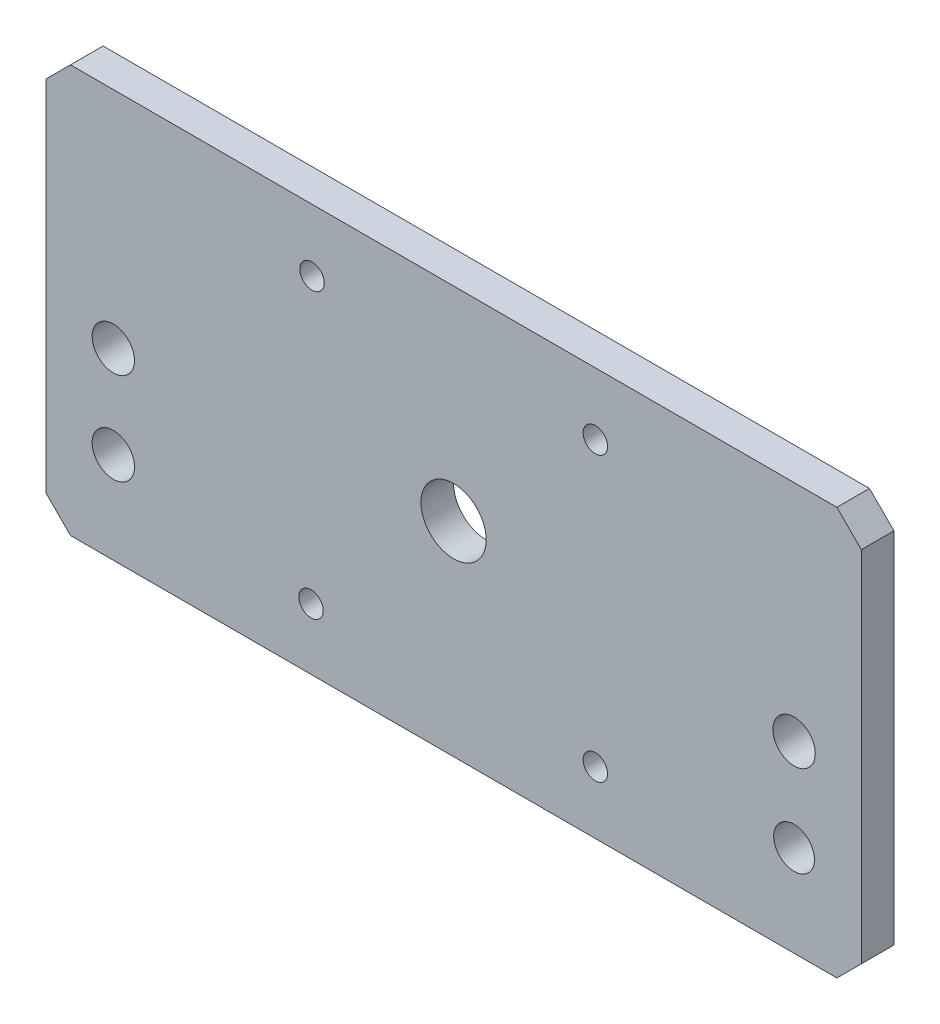
ISO-10303-21;
HEADER;
FILE_DESCRIPTION(('STEP AP214'),'2;1');
FILE_NAME('part.step','',(''),(''),'','','');
FILE_SCHEMA(('AUTOMOTIVE_DESIGN { 1 0 10303 214 1 1 1 1 }'));
ENDSEC;
DATA;
#1=APPLICATION_CONTEXT('core data for automotive mechanical design processes');
#2=APPLICATION_PROTOCOL_DEFINITION('international standard','automotive_design',2000,#1);
#3=PRODUCT_CONTEXT('',#1,'mechanical');
#4=PRODUCT('Part','Part','',(#3));
#5=PRODUCT_RELATED_PRODUCT_CATEGORY('part','',(#4));
#6=PRODUCT_DEFINITION_FORMATION('','',#4);
#7=PRODUCT_DEFINITION_CONTEXT('part definition',#1,'design');
#8=PRODUCT_DEFINITION('design','',#6,#7);
#9=PRODUCT_DEFINITION_SHAPE('','',#8);
#10=(LENGTH_UNIT() NAMED_UNIT(*) SI_UNIT(.MILLI.,.METRE.));
#11=(NAMED_UNIT(*) PLANE_ANGLE_UNIT() SI_UNIT($,.RADIAN.));
#12=(NAMED_UNIT(*) SI_UNIT($,.STERADIAN.) SOLID_ANGLE_UNIT());
#13=UNCERTAINTY_MEASURE_WITH_UNIT(LENGTH_MEASURE(1.E-05),#10,'distance_accuracy_value','');
#14=(GEOMETRIC_REPRESENTATION_CONTEXT(3) GLOBAL_UNCERTAINTY_ASSIGNED_CONTEXT((#13)) GLOBAL_UNIT_ASSIGNED_CONTEXT((#10,
#11,#12)) REPRESENTATION_CONTEXT('',''));
#15=CARTESIAN_POINT('',(0.,0.,0.));
#16=DIRECTION('',(0.,0.,1.));
#17=DIRECTION('',(1.,0.,0.));
#18=AXIS2_PLACEMENT_3D('',#15,#16,#17);
#19=CARTESIAN_POINT('',(-10.,0.,4.));
#20=DIRECTION('',(1.,0.,0.));
#21=DIRECTION('',(0.,1.,0.));
#22=AXIS2_PLACEMENT_3D('',#19,#20,#21);
#23=PLANE('',#22);
#24=DIRECTION('',(0.,-1.,0.));
#25=VECTOR('',#24,1.);
#26=CARTESIAN_POINT('',(-10.,0.,0.));
#27=LINE('',#26,#25);
#28=CARTESIAN_POINT('',(-10.,-3.,0.));
#29=VERTEX_POINT('',#28);
#30=CARTESIAN_POINT('',(-9.99999999999999,-47.,0.));
#31=VERTEX_POINT('',#30);
#32=EDGE_CURVE('E132',#29,#31,#27,.T.);
#33=ORIENTED_EDGE('',*,*,#32,.T.);
#34=DIRECTION('',(0.,0.,1.));
#35=VECTOR('',#34,1.);
#36=CARTESIAN_POINT('',(-9.99999999999999,-47.,4.));
#37=LINE('',#36,#35);
#38=CARTESIAN_POINT('',(-9.99999999999999,-47.,4.));
#39=VERTEX_POINT('',#38);
#40=EDGE_CURVE('E155',#31,#39,#37,.T.);
#41=ORIENTED_EDGE('',*,*,#40,.T.);
#42=DIRECTION('',(0.,-1.,0.));
#43=VECTOR('',#42,1.);
#44=CARTESIAN_POINT('',(-10.,0.,4.));
#45=LINE('',#44,#43);
#46=CARTESIAN_POINT('',(-10.,-3.,4.));
#47=VERTEX_POINT('',#46);
#48=EDGE_CURVE('E130',#47,#39,#45,.T.);
#49=ORIENTED_EDGE('',*,*,#48,.F.);
#50=DIRECTION('',(0.,0.,-1.));
#51=VECTOR('',#50,1.);
#52=CARTESIAN_POINT('',(-10.,-3.,4.));
#53=LINE('',#52,#51);
#54=EDGE_CURVE('E152',#47,#29,#53,.T.);
#55=ORIENTED_EDGE('',*,*,#54,.T.);
#56=EDGE_LOOP('',(#33,#41,#49,#55));
#57=FACE_BOUND('',#56,.T.);
#58=ADVANCED_FACE('F37',(#57),#23,.F.);
#59=CARTESIAN_POINT('',(-9.99999999999999,-50.,4.));
#60=DIRECTION('',(0.,1.,0.));
#61=DIRECTION('',(0.,0.,1.));
#62=AXIS2_PLACEMENT_3D('',#59,#60,#61);
#63=PLANE('',#62);
#64=DIRECTION('',(1.,0.,0.));
#65=VECTOR('',#64,1.);
#66=CARTESIAN_POINT('',(-9.99999999999999,-50.,0.));
#67=LINE('',#66,#65);
#68=CARTESIAN_POINT('',(-6.99999999999999,-50.,0.));
#69=VERTEX_POINT('',#68);
#70=CARTESIAN_POINT('',(87.,-50.,0.));
#71=VERTEX_POINT('',#70);
#72=EDGE_CURVE('E128',#69,#71,#67,.T.);
#73=ORIENTED_EDGE('',*,*,#72,.T.);
#74=DIRECTION('',(0.,0.,1.));
#75=VECTOR('',#74,1.);
#76=CARTESIAN_POINT('',(87.,-50.,4.));
#77=LINE('',#76,#75);
#78=CARTESIAN_POINT('',(87.,-50.,4.));
#79=VERTEX_POINT('',#78);
#80=EDGE_CURVE('E107',#71,#79,#77,.T.);
#81=ORIENTED_EDGE('',*,*,#80,.T.);
#82=DIRECTION('',(1.,0.,0.));
#83=VECTOR('',#82,1.);
#84=CARTESIAN_POINT('',(-9.99999999999999,-50.,4.));
#85=LINE('',#84,#83);
#86=CARTESIAN_POINT('',(-6.99999999999999,-50.,4.));
#87=VERTEX_POINT('',#86);
#88=EDGE_CURVE('E171',#87,#79,#85,.T.);
#89=ORIENTED_EDGE('',*,*,#88,.F.);
#90=DIRECTION('',(0.,0.,-1.));
#91=VECTOR('',#90,1.);
#92=CARTESIAN_POINT('',(-6.99999999999999,-50.,4.));
#93=LINE('',#92,#91);
#94=EDGE_CURVE('E112',#87,#69,#93,.T.);
#95=ORIENTED_EDGE('',*,*,#94,.T.);
#96=EDGE_LOOP('',(#73,#81,#89,#95));
#97=FACE_BOUND('',#96,.T.);
#98=ADVANCED_FACE('F262',(#97),#63,.F.);
#99=CARTESIAN_POINT('',(90.,0.,4.));
#100=DIRECTION('',(-1.,0.,0.));
#101=DIRECTION('',(0.,0.,1.));
#102=AXIS2_PLACEMENT_3D('',#99,#100,#101);
#103=PLANE('',#102);
#104=DIRECTION('',(0.,1.,0.));
#105=VECTOR('',#104,1.);
#106=CARTESIAN_POINT('',(90.,0.,4.));
#107=LINE('',#106,#105);
#108=CARTESIAN_POINT('',(90.,-47.,4.));
#109=VERTEX_POINT('',#108);
#110=CARTESIAN_POINT('',(90.,-3.,4.));
#111=VERTEX_POINT('',#110);
#112=EDGE_CURVE('E121',#109,#111,#107,.T.);
#113=ORIENTED_EDGE('',*,*,#112,.F.);
#114=DIRECTION('',(0.,0.,-1.));
#115=VECTOR('',#114,1.);
#116=CARTESIAN_POINT('',(90.,-47.,4.));
#117=LINE('',#116,#115);
#118=CARTESIAN_POINT('',(90.,-47.,0.));
#119=VERTEX_POINT('',#118);
#120=EDGE_CURVE('E106',#109,#119,#117,.T.);
#121=ORIENTED_EDGE('',*,*,#120,.T.);
#122=DIRECTION('',(0.,1.,0.));
#123=VECTOR('',#122,1.);
#124=CARTESIAN_POINT('',(90.,0.,0.));
#125=LINE('',#124,#123);
#126=CARTESIAN_POINT('',(90.,-3.,0.));
#127=VERTEX_POINT('',#126);
#128=EDGE_CURVE('E119',#119,#127,#125,.T.);
#129=ORIENTED_EDGE('',*,*,#128,.T.);
#130=DIRECTION('',(0.,0.,1.));
#131=VECTOR('',#130,1.);
#132=CARTESIAN_POINT('',(90.,-3.,4.));
#133=LINE('',#132,#131);
#134=EDGE_CURVE('E123',#127,#111,#133,.T.);
#135=ORIENTED_EDGE('',*,*,#134,.T.);
#136=EDGE_LOOP('',(#113,#121,#129,#135));
#137=FACE_BOUND('',#136,.T.);
#138=ADVANCED_FACE('F118',(#137),#103,.F.);
#139=CARTESIAN_POINT('',(-10.,0.,4.));
#140=DIRECTION('',(0.,-1.,0.));
#141=DIRECTION('',(0.,0.,-1.));
#142=AXIS2_PLACEMENT_3D('',#139,#140,#141);
#143=PLANE('',#142);
#144=DIRECTION('',(-1.,0.,0.));
#145=VECTOR('',#144,1.);
#146=CARTESIAN_POINT('',(-10.,0.,0.));
#147=LINE('',#146,#145);
#148=CARTESIAN_POINT('',(87.,0.,0.));
#149=VERTEX_POINT('',#148);
#150=CARTESIAN_POINT('',(-7.,0.,0.));
#151=VERTEX_POINT('',#150);
#152=EDGE_CURVE('E127',#149,#151,#147,.T.);
#153=ORIENTED_EDGE('',*,*,#152,.T.);
#154=DIRECTION('',(0.,0.,1.));
#155=VECTOR('',#154,1.);
#156=CARTESIAN_POINT('',(-7.,0.,4.));
#157=LINE('',#156,#155);
#158=CARTESIAN_POINT('',(-7.,0.,4.));
#159=VERTEX_POINT('',#158);
#160=EDGE_CURVE('E13',#151,#159,#157,.T.);
#161=ORIENTED_EDGE('',*,*,#160,.T.);
#162=DIRECTION('',(-1.,0.,0.));
#163=VECTOR('',#162,1.);
#164=CARTESIAN_POINT('',(-10.,0.,4.));
#165=LINE('',#164,#163);
#166=CARTESIAN_POINT('',(87.,0.,4.));
#167=VERTEX_POINT('',#166);
#168=EDGE_CURVE('E136',#167,#159,#165,.T.);
#169=ORIENTED_EDGE('',*,*,#168,.F.);
#170=DIRECTION('',(0.,0.,-1.));
#171=VECTOR('',#170,1.);
#172=CARTESIAN_POINT('',(87.,0.,4.));
#173=LINE('',#172,#171);
#174=EDGE_CURVE('E45',#167,#149,#173,.T.);
#175=ORIENTED_EDGE('',*,*,#174,.T.);
#176=EDGE_LOOP('',(#153,#161,#169,#175));
#177=FACE_BOUND('',#176,.T.);
#178=ADVANCED_FACE('F158',(#177),#143,.F.);
#179=CARTESIAN_POINT('',(0.,0.,4.));
#180=DIRECTION('',(0.,0.,1.));
#181=DIRECTION('',(1.,0.,0.));
#182=AXIS2_PLACEMENT_3D('',#179,#180,#181);
#183=PLANE('',#182);
#184=CARTESIAN_POINT('',(81.75,-38.8,4.));
#185=DIRECTION('',(0.,0.,1.));
#186=DIRECTION('',(1.,0.,0.));
#187=AXIS2_PLACEMENT_3D('',#184,#185,#186);
#188=CIRCLE('',#187,2.49849627961582);
#189=CARTESIAN_POINT('',(84.2484962796158,-38.8,4.));
#190=VERTEX_POINT('',#189);
#191=EDGE_CURVE('E224',#190,#190,#188,.T.);
#192=ORIENTED_EDGE('',*,*,#191,.F.);
#193=EDGE_LOOP('',(#192));
#194=FACE_BOUND('',#193,.T.);
#195=CARTESIAN_POINT('',(-1.75,-27.5,4.));
#196=DIRECTION('',(0.,0.,1.));
#197=DIRECTION('',(1.,0.,0.));
#198=AXIS2_PLACEMENT_3D('',#195,#196,#197);
#199=CIRCLE('',#198,2.6);
#200=CARTESIAN_POINT('',(0.850000000000003,-27.5,4.));
#201=VERTEX_POINT('',#200);
#202=EDGE_CURVE('E217',#201,#201,#199,.T.);
#203=ORIENTED_EDGE('',*,*,#202,.F.);
#204=EDGE_LOOP('',(#203));
#205=FACE_BOUND('',#204,.T.);
#206=CARTESIAN_POINT('',(-1.75,-38.8,4.));
#207=DIRECTION('',(0.,0.,1.));
#208=DIRECTION('',(1.,0.,0.));
#209=AXIS2_PLACEMENT_3D('',#206,#207,#208);
#210=CIRCLE('',#209,2.6);
#211=CARTESIAN_POINT('',(0.850000000000001,-38.8,4.));
#212=VERTEX_POINT('',#211);
#213=EDGE_CURVE('E229',#212,#212,#210,.T.);
#214=ORIENTED_EDGE('',*,*,#213,.F.);
#215=EDGE_LOOP('',(#214));
#216=FACE_BOUND('',#215,.T.);
#217=CARTESIAN_POINT('',(81.75,-27.5,4.));
#218=DIRECTION('',(0.,0.,1.));
#219=DIRECTION('',(1.,0.,0.));
#220=AXIS2_PLACEMENT_3D('',#217,#218,#219);
#221=CIRCLE('',#220,2.59999999999999);
#222=CARTESIAN_POINT('',(84.35,-27.5,4.));
#223=VERTEX_POINT('',#222);
#224=EDGE_CURVE('E211',#223,#223,#221,.T.);
#225=ORIENTED_EDGE('',*,*,#224,.F.);
#226=EDGE_LOOP('',(#225));
#227=FACE_BOUND('',#226,.T.);
#228=CARTESIAN_POINT('',(39.9848934541779,-24.9737182491163,4.));
#229=DIRECTION('',(0.,0.,-1.));
#230=DIRECTION('',(-1.,0.,0.));
#231=AXIS2_PLACEMENT_3D('',#228,#229,#230);
#232=CIRCLE('',#231,4.);
#233=CARTESIAN_POINT('',(35.9848934541779,-24.9737182491163,4.));
#234=VERTEX_POINT('',#233);
#235=EDGE_CURVE('E191',#234,#234,#232,.T.);
#236=ORIENTED_EDGE('',*,*,#235,.T.);
#237=EDGE_LOOP('',(#236));
#238=FACE_BOUND('',#237,.T.);
#239=CARTESIAN_POINT('',(22.5,-42.5,4.));
#240=DIRECTION('',(0.,0.,-1.));
#241=DIRECTION('',(-1.,0.,0.));
#242=AXIS2_PLACEMENT_3D('',#239,#240,#241);
#243=CIRCLE('',#242,1.5);
#244=CARTESIAN_POINT('',(21.,-42.5,4.));
#245=VERTEX_POINT('',#244);
#246=EDGE_CURVE('E190',#245,#245,#243,.T.);
#247=ORIENTED_EDGE('',*,*,#246,.T.);
#248=EDGE_LOOP('',(#247));
#249=FACE_BOUND('',#248,.T.);
#250=CARTESIAN_POINT('',(57.375,-7.62500000000002,4.));
#251=DIRECTION('',(0.,0.,-1.));
#252=DIRECTION('',(-1.,0.,0.));
#253=AXIS2_PLACEMENT_3D('',#250,#251,#252);
#254=CIRCLE('',#253,1.5);
#255=CARTESIAN_POINT('',(55.875,-7.62500000000002,4.));
#256=VERTEX_POINT('',#255);
#257=EDGE_CURVE('E197',#256,#256,#254,.T.);
#258=ORIENTED_EDGE('',*,*,#257,.T.);
#259=EDGE_LOOP('',(#258));
#260=FACE_BOUND('',#259,.T.);
#261=CARTESIAN_POINT('',(57.375,-42.375,4.));
#262=DIRECTION('',(0.,0.,-1.));
#263=DIRECTION('',(-1.,0.,0.));
#264=AXIS2_PLACEMENT_3D('',#261,#262,#263);
#265=CIRCLE('',#264,1.5);
#266=CARTESIAN_POINT('',(55.875,-42.375,4.));
#267=VERTEX_POINT('',#266);
#268=EDGE_CURVE('E185',#267,#267,#265,.T.);
#269=ORIENTED_EDGE('',*,*,#268,.T.);
#270=EDGE_LOOP('',(#269));
#271=FACE_BOUND('',#270,.T.);
#272=CARTESIAN_POINT('',(22.625,-7.62500000000002,4.));
#273=DIRECTION('',(0.,0.,-1.));
#274=DIRECTION('',(-1.,0.,0.));
#275=AXIS2_PLACEMENT_3D('',#272,#273,#274);
#276=CIRCLE('',#275,1.5);
#277=CARTESIAN_POINT('',(21.125,-7.62500000000002,4.));
#278=VERTEX_POINT('',#277);
#279=EDGE_CURVE('E180',#278,#278,#276,.T.);
#280=ORIENTED_EDGE('',*,*,#279,.T.);
#281=EDGE_LOOP('',(#280));
#282=FACE_BOUND('',#281,.T.);
#283=ORIENTED_EDGE('',*,*,#88,.T.);
#284=DIRECTION('',(-0.707106781186548,-0.707106781186548,0.));
#285=VECTOR('',#284,1.);
#286=CARTESIAN_POINT('',(68.5,-68.5,4.));
#287=LINE('',#286,#285);
#288=EDGE_CURVE('E150',#79,#109,#287,.F.);
#289=ORIENTED_EDGE('',*,*,#288,.T.);
#290=ORIENTED_EDGE('',*,*,#112,.T.);
#291=DIRECTION('',(0.707106781186548,-0.707106781186547,0.));
#292=VECTOR('',#291,1.);
#293=CARTESIAN_POINT('',(43.5,43.5,4.));
#294=LINE('',#293,#292);
#295=EDGE_CURVE('E57',#111,#167,#294,.F.);
#296=ORIENTED_EDGE('',*,*,#295,.T.);
#297=ORIENTED_EDGE('',*,*,#168,.T.);
#298=DIRECTION('',(0.707106781186547,0.707106781186548,0.));
#299=VECTOR('',#298,1.);
#300=CARTESIAN_POINT('',(-3.5,3.5,4.));
#301=LINE('',#300,#299);
#302=EDGE_CURVE('E146',#159,#47,#301,.F.);
#303=ORIENTED_EDGE('',*,*,#302,.T.);
#304=ORIENTED_EDGE('',*,*,#48,.T.);
#305=DIRECTION('',(-0.707106781186547,0.707106781186548,0.));
#306=VECTOR('',#305,1.);
#307=CARTESIAN_POINT('',(-28.5,-28.5,4.));
#308=LINE('',#307,#306);
#309=EDGE_CURVE('E148',#39,#87,#308,.F.);
#310=ORIENTED_EDGE('',*,*,#309,.T.);
#311=EDGE_LOOP('',(#283,#289,#290,#296,#297,#303,#304,#310));
#312=FACE_BOUND('',#311,.T.);
#313=ADVANCED_FACE('F245',(#194,#205,#216,#227,#238,#249,#260,#271,#282,#312),#183,.T.);
#314=CARTESIAN_POINT('',(0.,0.,0.));
#315=DIRECTION('',(0.,0.,1.));
#316=DIRECTION('',(1.,0.,0.));
#317=AXIS2_PLACEMENT_3D('',#314,#315,#316);
#318=PLANE('',#317);
#319=CARTESIAN_POINT('',(81.75,-38.8,0.));
#320=DIRECTION('',(0.,0.,1.));
#321=DIRECTION('',(1.,0.,0.));
#322=AXIS2_PLACEMENT_3D('',#319,#320,#321);
#323=CIRCLE('',#322,2.49849627961582);
#324=CARTESIAN_POINT('',(84.2484962796158,-38.8,0.));
#325=VERTEX_POINT('',#324);
#326=EDGE_CURVE('E214',#325,#325,#323,.T.);
#327=ORIENTED_EDGE('',*,*,#326,.T.);
#328=EDGE_LOOP('',(#327));
#329=FACE_BOUND('',#328,.T.);
#330=CARTESIAN_POINT('',(-1.75,-27.5,0.));
#331=DIRECTION('',(0.,0.,1.));
#332=DIRECTION('',(1.,0.,0.));
#333=AXIS2_PLACEMENT_3D('',#330,#331,#332);
#334=CIRCLE('',#333,2.6);
#335=CARTESIAN_POINT('',(0.850000000000003,-27.5,0.));
#336=VERTEX_POINT('',#335);
#337=EDGE_CURVE('E220',#336,#336,#334,.T.);
#338=ORIENTED_EDGE('',*,*,#337,.T.);
#339=EDGE_LOOP('',(#338));
#340=FACE_BOUND('',#339,.T.);
#341=CARTESIAN_POINT('',(-1.75,-38.8,0.));
#342=DIRECTION('',(0.,0.,1.));
#343=DIRECTION('',(1.,0.,0.));
#344=AXIS2_PLACEMENT_3D('',#341,#342,#343);
#345=CIRCLE('',#344,2.6);
#346=CARTESIAN_POINT('',(0.850000000000001,-38.8,0.));
#347=VERTEX_POINT('',#346);
#348=EDGE_CURVE('E221',#347,#347,#345,.T.);
#349=ORIENTED_EDGE('',*,*,#348,.T.);
#350=EDGE_LOOP('',(#349));
#351=FACE_BOUND('',#350,.T.);
#352=CARTESIAN_POINT('',(81.75,-27.5,0.));
#353=DIRECTION('',(0.,0.,1.));
#354=DIRECTION('',(1.,0.,0.));
#355=AXIS2_PLACEMENT_3D('',#352,#353,#354);
#356=CIRCLE('',#355,2.59999999999999);
#357=CARTESIAN_POINT('',(84.35,-27.5,0.));
#358=VERTEX_POINT('',#357);
#359=EDGE_CURVE('E208',#358,#358,#356,.T.);
#360=ORIENTED_EDGE('',*,*,#359,.T.);
#361=EDGE_LOOP('',(#360));
#362=FACE_BOUND('',#361,.T.);
#363=CARTESIAN_POINT('',(39.9848934541779,-24.9737182491163,0.));
#364=DIRECTION('',(0.,0.,-1.));
#365=DIRECTION('',(-1.,0.,0.));
#366=AXIS2_PLACEMENT_3D('',#363,#364,#365);
#367=CIRCLE('',#366,4.);
#368=CARTESIAN_POINT('',(35.9848934541779,-24.9737182491163,0.));
#369=VERTEX_POINT('',#368);
#370=EDGE_CURVE('E205',#369,#369,#367,.T.);
#371=ORIENTED_EDGE('',*,*,#370,.F.);
#372=EDGE_LOOP('',(#371));
#373=FACE_BOUND('',#372,.T.);
#374=CARTESIAN_POINT('',(22.5,-42.5,0.));
#375=DIRECTION('',(0.,0.,-1.));
#376=DIRECTION('',(-1.,0.,0.));
#377=AXIS2_PLACEMENT_3D('',#374,#375,#376);
#378=CIRCLE('',#377,1.5);
#379=CARTESIAN_POINT('',(21.,-42.5,0.));
#380=VERTEX_POINT('',#379);
#381=EDGE_CURVE('E187',#380,#380,#378,.T.);
#382=ORIENTED_EDGE('',*,*,#381,.F.);
#383=EDGE_LOOP('',(#382));
#384=FACE_BOUND('',#383,.T.);
#385=CARTESIAN_POINT('',(57.375,-7.62500000000002,0.));
#386=DIRECTION('',(0.,0.,-1.));
#387=DIRECTION('',(-1.,0.,0.));
#388=AXIS2_PLACEMENT_3D('',#385,#386,#387);
#389=CIRCLE('',#388,1.5);
#390=CARTESIAN_POINT('',(55.875,-7.62500000000002,0.));
#391=VERTEX_POINT('',#390);
#392=EDGE_CURVE('E194',#391,#391,#389,.T.);
#393=ORIENTED_EDGE('',*,*,#392,.F.);
#394=EDGE_LOOP('',(#393));
#395=FACE_BOUND('',#394,.T.);
#396=CARTESIAN_POINT('',(57.375,-42.375,0.));
#397=DIRECTION('',(0.,0.,-1.));
#398=DIRECTION('',(-1.,0.,0.));
#399=AXIS2_PLACEMENT_3D('',#396,#397,#398);
#400=CIRCLE('',#399,1.5);
#401=CARTESIAN_POINT('',(55.875,-42.375,0.));
#402=VERTEX_POINT('',#401);
#403=EDGE_CURVE('E200',#402,#402,#400,.T.);
#404=ORIENTED_EDGE('',*,*,#403,.F.);
#405=EDGE_LOOP('',(#404));
#406=FACE_BOUND('',#405,.T.);
#407=CARTESIAN_POINT('',(22.625,-7.62500000000002,0.));
#408=DIRECTION('',(0.,0.,-1.));
#409=DIRECTION('',(-1.,0.,0.));
#410=AXIS2_PLACEMENT_3D('',#407,#408,#409);
#411=CIRCLE('',#410,1.5);
#412=CARTESIAN_POINT('',(21.125,-7.62500000000002,0.));
#413=VERTEX_POINT('',#412);
#414=EDGE_CURVE('E176',#413,#413,#411,.T.);
#415=ORIENTED_EDGE('',*,*,#414,.F.);
#416=EDGE_LOOP('',(#415));
#417=FACE_BOUND('',#416,.T.);
#418=ORIENTED_EDGE('',*,*,#128,.F.);
#419=DIRECTION('',(0.707106781186548,0.707106781186548,0.));
#420=VECTOR('',#419,1.);
#421=CARTESIAN_POINT('',(90.,-47.,0.));
#422=LINE('',#421,#420);
#423=EDGE_CURVE('E102',#119,#71,#422,.F.);
#424=ORIENTED_EDGE('',*,*,#423,.T.);
#425=ORIENTED_EDGE('',*,*,#72,.F.);
#426=DIRECTION('',(0.707106781186547,-0.707106781186548,0.));
#427=VECTOR('',#426,1.);
#428=CARTESIAN_POINT('',(-6.99999999999999,-50.,0.));
#429=LINE('',#428,#427);
#430=EDGE_CURVE('E113',#69,#31,#429,.F.);
#431=ORIENTED_EDGE('',*,*,#430,.T.);
#432=ORIENTED_EDGE('',*,*,#32,.F.);
#433=DIRECTION('',(-0.707106781186547,-0.707106781186548,0.));
#434=VECTOR('',#433,1.);
#435=CARTESIAN_POINT('',(-10.,-3.,0.));
#436=LINE('',#435,#434);
#437=EDGE_CURVE('E139',#29,#151,#436,.F.);
#438=ORIENTED_EDGE('',*,*,#437,.T.);
#439=ORIENTED_EDGE('',*,*,#152,.F.);
#440=DIRECTION('',(-0.707106781186548,0.707106781186547,0.));
#441=VECTOR('',#440,1.);
#442=CARTESIAN_POINT('',(87.,0.,0.));
#443=LINE('',#442,#441);
#444=EDGE_CURVE('E122',#149,#127,#443,.F.);
#445=ORIENTED_EDGE('',*,*,#444,.T.);
#446=EDGE_LOOP('',(#418,#424,#425,#431,#432,#438,#439,#445));
#447=FACE_BOUND('',#446,.T.);
#448=ADVANCED_FACE('F125',(#329,#340,#351,#362,#373,#384,#395,#406,#417,#447),#318,.F.);
#449=CARTESIAN_POINT('',(22.625,-7.62500000000002,4.));
#450=DIRECTION('',(0.,0.,-1.));
#451=DIRECTION('',(-1.,0.,0.));
#452=AXIS2_PLACEMENT_3D('',#449,#450,#451);
#453=CYLINDRICAL_SURFACE('',#452,1.5);
#454=ORIENTED_EDGE('',*,*,#279,.F.);
#455=EDGE_LOOP('',(#454));
#456=FACE_BOUND('',#455,.T.);
#457=ORIENTED_EDGE('',*,*,#414,.T.);
#458=EDGE_LOOP('',(#457));
#459=FACE_BOUND('',#458,.T.);
#460=ADVANCED_FACE('F285',(#456,#459),#453,.F.);
#461=CARTESIAN_POINT('',(57.375,-42.375,4.));
#462=DIRECTION('',(0.,0.,-1.));
#463=DIRECTION('',(-1.,0.,0.));
#464=AXIS2_PLACEMENT_3D('',#461,#462,#463);
#465=CYLINDRICAL_SURFACE('',#464,1.5);
#466=ORIENTED_EDGE('',*,*,#268,.F.);
#467=EDGE_LOOP('',(#466));
#468=FACE_BOUND('',#467,.T.);
#469=ORIENTED_EDGE('',*,*,#403,.T.);
#470=EDGE_LOOP('',(#469));
#471=FACE_BOUND('',#470,.T.);
#472=ADVANCED_FACE('F290',(#468,#471),#465,.F.);
#473=CARTESIAN_POINT('',(57.375,-7.62500000000002,4.));
#474=DIRECTION('',(0.,0.,-1.));
#475=DIRECTION('',(-1.,0.,0.));
#476=AXIS2_PLACEMENT_3D('',#473,#474,#475);
#477=CYLINDRICAL_SURFACE('',#476,1.5);
#478=ORIENTED_EDGE('',*,*,#257,.F.);
#479=EDGE_LOOP('',(#478));
#480=FACE_BOUND('',#479,.T.);
#481=ORIENTED_EDGE('',*,*,#392,.T.);
#482=EDGE_LOOP('',(#481));
#483=FACE_BOUND('',#482,.T.);
#484=ADVANCED_FACE('F295',(#480,#483),#477,.F.);
#485=CARTESIAN_POINT('',(22.5,-42.5,4.));
#486=DIRECTION('',(0.,0.,-1.));
#487=DIRECTION('',(-1.,0.,0.));
#488=AXIS2_PLACEMENT_3D('',#485,#486,#487);
#489=CYLINDRICAL_SURFACE('',#488,1.5);
#490=ORIENTED_EDGE('',*,*,#246,.F.);
#491=EDGE_LOOP('',(#490));
#492=FACE_BOUND('',#491,.T.);
#493=ORIENTED_EDGE('',*,*,#381,.T.);
#494=EDGE_LOOP('',(#493));
#495=FACE_BOUND('',#494,.T.);
#496=ADVANCED_FACE('F292',(#492,#495),#489,.F.);
#497=CARTESIAN_POINT('',(39.9848934541779,-24.9737182491163,4.));
#498=DIRECTION('',(0.,0.,-1.));
#499=DIRECTION('',(-1.,0.,0.));
#500=AXIS2_PLACEMENT_3D('',#497,#498,#499);
#501=CYLINDRICAL_SURFACE('',#500,4.);
#502=ORIENTED_EDGE('',*,*,#235,.F.);
#503=EDGE_LOOP('',(#502));
#504=FACE_BOUND('',#503,.T.);
#505=ORIENTED_EDGE('',*,*,#370,.T.);
#506=EDGE_LOOP('',(#505));
#507=FACE_BOUND('',#506,.T.);
#508=ADVANCED_FACE('F271',(#504,#507),#501,.F.);
#509=CARTESIAN_POINT('',(90.,-47.,4.));
#510=DIRECTION('',(-0.707106781186547,0.707106781186547,0.));
#511=DIRECTION('',(0.,0.,-1.));
#512=AXIS2_PLACEMENT_3D('',#509,#510,#511);
#513=PLANE('',#512);
#514=ORIENTED_EDGE('',*,*,#288,.F.);
#515=ORIENTED_EDGE('',*,*,#80,.F.);
#516=ORIENTED_EDGE('',*,*,#423,.F.);
#517=ORIENTED_EDGE('',*,*,#120,.F.);
#518=EDGE_LOOP('',(#514,#515,#516,#517));
#519=FACE_BOUND('',#518,.T.);
#520=ADVANCED_FACE('F105',(#519),#513,.F.);
#521=CARTESIAN_POINT('',(-6.99999999999999,-50.,4.));
#522=DIRECTION('',(0.707106781186548,0.707106781186547,0.));
#523=DIRECTION('',(0.,0.,-1.));
#524=AXIS2_PLACEMENT_3D('',#521,#522,#523);
#525=PLANE('',#524);
#526=ORIENTED_EDGE('',*,*,#309,.F.);
#527=ORIENTED_EDGE('',*,*,#40,.F.);
#528=ORIENTED_EDGE('',*,*,#430,.F.);
#529=ORIENTED_EDGE('',*,*,#94,.F.);
#530=EDGE_LOOP('',(#526,#527,#528,#529));
#531=FACE_BOUND('',#530,.T.);
#532=ADVANCED_FACE('F264',(#531),#525,.F.);
#533=CARTESIAN_POINT('',(-10.,-3.,4.));
#534=DIRECTION('',(0.707106781186548,-0.707106781186547,0.));
#535=DIRECTION('',(0.,0.,-1.));
#536=AXIS2_PLACEMENT_3D('',#533,#534,#535);
#537=PLANE('',#536);
#538=ORIENTED_EDGE('',*,*,#302,.F.);
#539=ORIENTED_EDGE('',*,*,#160,.F.);
#540=ORIENTED_EDGE('',*,*,#437,.F.);
#541=ORIENTED_EDGE('',*,*,#54,.F.);
#542=EDGE_LOOP('',(#538,#539,#540,#541));
#543=FACE_BOUND('',#542,.T.);
#544=ADVANCED_FACE('F165',(#543),#537,.F.);
#545=CARTESIAN_POINT('',(87.,0.,4.));
#546=DIRECTION('',(-0.707106781186547,-0.707106781186548,0.));
#547=DIRECTION('',(0.,0.,-1.));
#548=AXIS2_PLACEMENT_3D('',#545,#546,#547);
#549=PLANE('',#548);
#550=ORIENTED_EDGE('',*,*,#295,.F.);
#551=ORIENTED_EDGE('',*,*,#134,.F.);
#552=ORIENTED_EDGE('',*,*,#444,.F.);
#553=ORIENTED_EDGE('',*,*,#174,.F.);
#554=EDGE_LOOP('',(#550,#551,#552,#553));
#555=FACE_BOUND('',#554,.T.);
#556=ADVANCED_FACE('F39',(#555),#549,.F.);
#557=CARTESIAN_POINT('',(81.75,-27.5,0.));
#558=DIRECTION('',(0.,0.,1.));
#559=DIRECTION('',(1.,0.,0.));
#560=AXIS2_PLACEMENT_3D('',#557,#558,#559);
#561=CYLINDRICAL_SURFACE('',#560,2.59999999999999);
#562=ORIENTED_EDGE('',*,*,#359,.F.);
#563=EDGE_LOOP('',(#562));
#564=FACE_BOUND('',#563,.T.);
#565=ORIENTED_EDGE('',*,*,#224,.T.);
#566=EDGE_LOOP('',(#565));
#567=FACE_BOUND('',#566,.T.);
#568=ADVANCED_FACE('F241',(#564,#567),#561,.F.);
#569=CARTESIAN_POINT('',(-1.75,-38.8,0.));
#570=DIRECTION('',(0.,0.,1.));
#571=DIRECTION('',(1.,0.,0.));
#572=AXIS2_PLACEMENT_3D('',#569,#570,#571);
#573=CYLINDRICAL_SURFACE('',#572,2.6);
#574=ORIENTED_EDGE('',*,*,#348,.F.);
#575=EDGE_LOOP('',(#574));
#576=FACE_BOUND('',#575,.T.);
#577=ORIENTED_EDGE('',*,*,#213,.T.);
#578=EDGE_LOOP('',(#577));
#579=FACE_BOUND('',#578,.T.);
#580=ADVANCED_FACE('F237',(#576,#579),#573,.F.);
#581=CARTESIAN_POINT('',(-1.75,-27.5,0.));
#582=DIRECTION('',(0.,0.,1.));
#583=DIRECTION('',(1.,0.,0.));
#584=AXIS2_PLACEMENT_3D('',#581,#582,#583);
#585=CYLINDRICAL_SURFACE('',#584,2.6);
#586=ORIENTED_EDGE('',*,*,#337,.F.);
#587=EDGE_LOOP('',(#586));
#588=FACE_BOUND('',#587,.T.);
#589=ORIENTED_EDGE('',*,*,#202,.T.);
#590=EDGE_LOOP('',(#589));
#591=FACE_BOUND('',#590,.T.);
#592=ADVANCED_FACE('F240',(#588,#591),#585,.F.);
#593=CARTESIAN_POINT('',(81.75,-38.8,0.));
#594=DIRECTION('',(0.,0.,1.));
#595=DIRECTION('',(1.,0.,0.));
#596=AXIS2_PLACEMENT_3D('',#593,#594,#595);
#597=CYLINDRICAL_SURFACE('',#596,2.49849627961582);
#598=ORIENTED_EDGE('',*,*,#326,.F.);
#599=EDGE_LOOP('',(#598));
#600=FACE_BOUND('',#599,.T.);
#601=ORIENTED_EDGE('',*,*,#191,.T.);
#602=EDGE_LOOP('',(#601));
#603=FACE_BOUND('',#602,.T.);
#604=ADVANCED_FACE('F311',(#600,#603),#597,.F.);
#605=CLOSED_SHELL('',(#58,#98,#138,#178,#313,#448,#460,#472,#484,#496,#508,#520,#532,#544,#556,
#568,#580,#592,#604));
#606=MANIFOLD_SOLID_BREP('B2',#605);
#607=ADVANCED_BREP_SHAPE_REPRESENTATION('',(#18,#606),#14);
#608=SHAPE_DEFINITION_REPRESENTATION(#9,#607);
ENDSEC;
END-ISO-10303-21;
